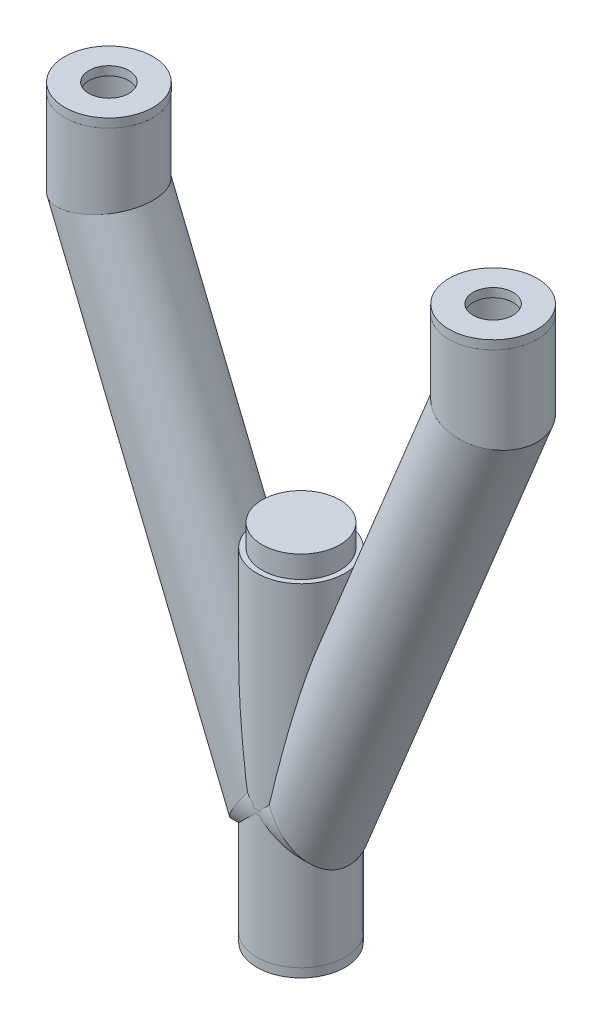
ISO-10303-21;
HEADER;
FILE_DESCRIPTION(('STEP AP214'),'2;1');
FILE_NAME('part.step','',(''),(''),'','','');
FILE_SCHEMA(('AUTOMOTIVE_DESIGN { 1 0 10303 214 1 1 1 1 }'));
ENDSEC;
DATA;
#1=APPLICATION_CONTEXT('core data for automotive mechanical design processes');
#2=APPLICATION_PROTOCOL_DEFINITION('international standard','automotive_design',2000,#1);
#3=PRODUCT_CONTEXT('',#1,'mechanical');
#4=PRODUCT('Part','Part','',(#3));
#5=PRODUCT_RELATED_PRODUCT_CATEGORY('part','',(#4));
#6=PRODUCT_DEFINITION_FORMATION('','',#4);
#7=PRODUCT_DEFINITION_CONTEXT('part definition',#1,'design');
#8=PRODUCT_DEFINITION('design','',#6,#7);
#9=PRODUCT_DEFINITION_SHAPE('','',#8);
#10=(LENGTH_UNIT() NAMED_UNIT(*) SI_UNIT(.MILLI.,.METRE.));
#11=(NAMED_UNIT(*) PLANE_ANGLE_UNIT() SI_UNIT($,.RADIAN.));
#12=(NAMED_UNIT(*) SI_UNIT($,.STERADIAN.) SOLID_ANGLE_UNIT());
#13=UNCERTAINTY_MEASURE_WITH_UNIT(LENGTH_MEASURE(1.E-05),#10,'distance_accuracy_value','');
#14=(GEOMETRIC_REPRESENTATION_CONTEXT(3) GLOBAL_UNCERTAINTY_ASSIGNED_CONTEXT((#13)) GLOBAL_UNIT_ASSIGNED_CONTEXT((#10,
#11,#12)) REPRESENTATION_CONTEXT('',''));
#15=CARTESIAN_POINT('',(0.,0.,0.));
#16=DIRECTION('',(0.,0.,1.));
#17=DIRECTION('',(1.,0.,0.));
#18=AXIS2_PLACEMENT_3D('',#15,#16,#17);
#19=CARTESIAN_POINT('',(0.,-95.6610128055879,0.));
#20=DIRECTION('',(0.,-1.,0.));
#21=DIRECTION('',(0.,0.,-1.));
#22=AXIS2_PLACEMENT_3D('',#19,#20,#21);
#23=PLANE('',#22);
#24=CARTESIAN_POINT('',(0.,-95.6610128055879,0.));
#25=DIRECTION('',(0.,-1.,0.));
#26=DIRECTION('',(0.,0.,-1.));
#27=AXIS2_PLACEMENT_3D('',#24,#25,#26);
#28=CIRCLE('',#27,12.7);
#29=CARTESIAN_POINT('',(0.,-95.6610128055879,-12.7));
#30=VERTEX_POINT('',#29);
#31=EDGE_CURVE('E12',#30,#30,#28,.T.);
#32=ORIENTED_EDGE('',*,*,#31,.T.);
#33=EDGE_LOOP('',(#32));
#34=FACE_BOUND('',#33,.T.);
#35=CARTESIAN_POINT('',(0.,-95.6610128055879,0.));
#36=DIRECTION('',(0.,-1.,0.));
#37=DIRECTION('',(0.,0.,-1.));
#38=AXIS2_PLACEMENT_3D('',#35,#36,#37);
#39=CIRCLE('',#38,5.75);
#40=CARTESIAN_POINT('',(0.,-95.6610128055879,-5.75));
#41=VERTEX_POINT('',#40);
#42=EDGE_CURVE('E69',#41,#41,#39,.T.);
#43=ORIENTED_EDGE('',*,*,#42,.F.);
#44=EDGE_LOOP('',(#43));
#45=FACE_BOUND('',#44,.T.);
#46=ADVANCED_FACE('F58',(#34,#45),#23,.T.);
#47=CARTESIAN_POINT('',(0.,-93.1210128055879,0.));
#48=DIRECTION('',(0.,-1.,0.));
#49=DIRECTION('',(0.,0.,-1.));
#50=AXIS2_PLACEMENT_3D('',#47,#48,#49);
#51=PLANE('',#50);
#52=CARTESIAN_POINT('',(0.,-93.1210128055879,0.));
#53=DIRECTION('',(0.,-1.,0.));
#54=DIRECTION('',(0.,0.,-1.));
#55=AXIS2_PLACEMENT_3D('',#52,#53,#54);
#56=CIRCLE('',#55,12.7);
#57=CARTESIAN_POINT('',(0.,-93.1210128055879,-12.7));
#58=VERTEX_POINT('',#57);
#59=EDGE_CURVE('E62',#58,#58,#56,.T.);
#60=ORIENTED_EDGE('',*,*,#59,.F.);
#61=EDGE_LOOP('',(#60));
#62=FACE_BOUND('',#61,.T.);
#63=CARTESIAN_POINT('',(0.,-93.1210128055879,0.));
#64=DIRECTION('',(0.,-1.,0.));
#65=DIRECTION('',(0.,0.,-1.));
#66=AXIS2_PLACEMENT_3D('',#63,#64,#65);
#67=CIRCLE('',#66,5.75);
#68=CARTESIAN_POINT('',(0.,-93.1210128055879,-5.75));
#69=VERTEX_POINT('',#68);
#70=EDGE_CURVE('E71',#69,#69,#67,.T.);
#71=ORIENTED_EDGE('',*,*,#70,.T.);
#72=EDGE_LOOP('',(#71));
#73=FACE_BOUND('',#72,.T.);
#74=ADVANCED_FACE('F81',(#62,#73),#51,.F.);
#75=CARTESIAN_POINT('',(0.,-95.6610128055879,0.));
#76=DIRECTION('',(0.,1.,0.));
#77=DIRECTION('',(0.,0.,1.));
#78=AXIS2_PLACEMENT_3D('',#75,#76,#77);
#79=CYLINDRICAL_SURFACE('',#78,12.7);
#80=ORIENTED_EDGE('',*,*,#31,.F.);
#81=EDGE_LOOP('',(#80));
#82=FACE_BOUND('',#81,.T.);
#83=ORIENTED_EDGE('',*,*,#59,.T.);
#84=EDGE_LOOP('',(#83));
#85=FACE_BOUND('',#84,.T.);
#86=ADVANCED_FACE('F60',(#82,#85),#79,.T.);
#87=CARTESIAN_POINT('',(0.,-95.6610128055879,0.));
#88=DIRECTION('',(0.,1.,0.));
#89=DIRECTION('',(0.,0.,1.));
#90=AXIS2_PLACEMENT_3D('',#87,#88,#89);
#91=CYLINDRICAL_SURFACE('',#90,5.75);
#92=ORIENTED_EDGE('',*,*,#42,.T.);
#93=EDGE_LOOP('',(#92));
#94=FACE_BOUND('',#93,.T.);
#95=ORIENTED_EDGE('',*,*,#70,.F.);
#96=EDGE_LOOP('',(#95));
#97=FACE_BOUND('',#96,.T.);
#98=ADVANCED_FACE('F77',(#94,#97),#91,.F.);
#99=CLOSED_SHELL('',(#46,#74,#86,#98));
#100=MANIFOLD_SOLID_BREP('B2',#99);
#101=CARTESIAN_POINT('',(0.,8.98905704307334,0.));
#102=DIRECTION('',(0.,-1.,0.));
#103=DIRECTION('',(0.,0.,-1.));
#104=AXIS2_PLACEMENT_3D('',#101,#102,#103);
#105=CYLINDRICAL_SURFACE('',#104,11.2);
#106=CARTESIAN_POINT('',(0.,8.98905704307334,0.));
#107=DIRECTION('',(0.,1.,0.));
#108=DIRECTION('',(0.,0.,-1.));
#109=AXIS2_PLACEMENT_3D('',#106,#107,#108);
#110=CIRCLE('',#109,11.2);
#111=CARTESIAN_POINT('',(0.,8.98905704307334,-11.2));
#112=VERTEX_POINT('',#111);
#113=EDGE_CURVE('E57',#112,#112,#110,.T.);
#114=ORIENTED_EDGE('',*,*,#113,.F.);
#115=EDGE_LOOP('',(#114));
#116=FACE_BOUND('',#115,.T.);
#117=CARTESIAN_POINT('',(0.,2.63905704307334,0.));
#118=DIRECTION('',(0.,1.,0.));
#119=DIRECTION('',(0.,0.,-1.));
#120=AXIS2_PLACEMENT_3D('',#117,#118,#119);
#121=CIRCLE('',#120,11.2);
#122=CARTESIAN_POINT('',(0.,2.63905704307334,-11.2));
#123=VERTEX_POINT('',#122);
#124=EDGE_CURVE('E131',#123,#123,#121,.T.);
#125=ORIENTED_EDGE('',*,*,#124,.T.);
#126=EDGE_LOOP('',(#125));
#127=FACE_BOUND('',#126,.T.);
#128=ADVANCED_FACE('F128',(#116,#127),#105,.T.);
#129=CARTESIAN_POINT('',(0.,8.98905704307334,0.));
#130=DIRECTION('',(0.,1.,0.));
#131=DIRECTION('',(0.,0.,1.));
#132=AXIS2_PLACEMENT_3D('',#129,#130,#131);
#133=PLANE('',#132);
#134=ORIENTED_EDGE('',*,*,#113,.T.);
#135=EDGE_LOOP('',(#134));
#136=FACE_BOUND('',#135,.T.);
#137=ADVANCED_FACE('F143',(#136),#133,.T.);
#138=CARTESIAN_POINT('',(0.,2.63905704307334,0.));
#139=DIRECTION('',(0.,1.,0.));
#140=DIRECTION('',(0.,0.,1.));
#141=AXIS2_PLACEMENT_3D('',#138,#139,#140);
#142=PLANE('',#141);
#143=ORIENTED_EDGE('',*,*,#124,.F.);
#144=EDGE_LOOP('',(#143));
#145=FACE_BOUND('',#144,.T.);
#146=ADVANCED_FACE('F141',(#145),#142,.F.);
#147=CLOSED_SHELL('',(#128,#137,#146));
#148=MANIFOLD_SOLID_BREP('B7',#147);
#149=CARTESIAN_POINT('',(55.3142806569062,91.1369150174622,0.));
#150=DIRECTION('',(0.,-1.,0.));
#151=DIRECTION('',(1.,0.,0.));
#152=AXIS2_PLACEMENT_3D('',#149,#150,#151);
#153=PLANE('',#152);
#154=CARTESIAN_POINT('',(55.3142806569062,91.1369150174622,0.));
#155=DIRECTION('',(0.,1.,0.));
#156=DIRECTION('',(1.,0.,0.));
#157=AXIS2_PLACEMENT_3D('',#154,#155,#156);
#158=CIRCLE('',#157,12.7);
#159=CARTESIAN_POINT('',(68.0142806569062,91.1369150174622,0.));
#160=VERTEX_POINT('',#159);
#161=EDGE_CURVE('E127',#160,#160,#158,.T.);
#162=ORIENTED_EDGE('',*,*,#161,.T.);
#163=EDGE_LOOP('',(#162));
#164=FACE_BOUND('',#163,.T.);
#165=CARTESIAN_POINT('',(55.3142806569062,91.1369150174622,0.));
#166=DIRECTION('',(0.,1.,0.));
#167=DIRECTION('',(1.,0.,0.));
#168=AXIS2_PLACEMENT_3D('',#165,#166,#167);
#169=CIRCLE('',#168,5.75);
#170=CARTESIAN_POINT('',(61.0642806569062,91.1369150174622,0.));
#171=VERTEX_POINT('',#170);
#172=EDGE_CURVE('E188',#171,#171,#169,.T.);
#173=ORIENTED_EDGE('',*,*,#172,.F.);
#174=EDGE_LOOP('',(#173));
#175=FACE_BOUND('',#174,.T.);
#176=ADVANCED_FACE('F177',(#164,#175),#153,.F.);
#177=CARTESIAN_POINT('',(55.3142806569062,88.5969150174622,0.));
#178=DIRECTION('',(0.,-1.,0.));
#179=DIRECTION('',(1.,0.,0.));
#180=AXIS2_PLACEMENT_3D('',#177,#178,#179);
#181=PLANE('',#180);
#182=CARTESIAN_POINT('',(55.3142806569062,88.5969150174622,0.));
#183=DIRECTION('',(0.,1.,0.));
#184=DIRECTION('',(1.,0.,0.));
#185=AXIS2_PLACEMENT_3D('',#182,#183,#184);
#186=CIRCLE('',#185,12.7);
#187=CARTESIAN_POINT('',(68.0142806569062,88.5969150174622,0.));
#188=VERTEX_POINT('',#187);
#189=EDGE_CURVE('E181',#188,#188,#186,.T.);
#190=ORIENTED_EDGE('',*,*,#189,.F.);
#191=EDGE_LOOP('',(#190));
#192=FACE_BOUND('',#191,.T.);
#193=CARTESIAN_POINT('',(55.3142806569062,88.5969150174622,0.));
#194=DIRECTION('',(0.,1.,0.));
#195=DIRECTION('',(1.,0.,0.));
#196=AXIS2_PLACEMENT_3D('',#193,#194,#195);
#197=CIRCLE('',#196,5.75);
#198=CARTESIAN_POINT('',(61.0642806569062,88.5969150174622,0.));
#199=VERTEX_POINT('',#198);
#200=EDGE_CURVE('E190',#199,#199,#197,.T.);
#201=ORIENTED_EDGE('',*,*,#200,.T.);
#202=EDGE_LOOP('',(#201));
#203=FACE_BOUND('',#202,.T.);
#204=ADVANCED_FACE('F200',(#192,#203),#181,.T.);
#205=CARTESIAN_POINT('',(55.3142806569062,91.1369150174622,0.));
#206=DIRECTION('',(0.,-1.,0.));
#207=DIRECTION('',(1.,0.,0.));
#208=AXIS2_PLACEMENT_3D('',#205,#206,#207);
#209=CYLINDRICAL_SURFACE('',#208,12.7);
#210=ORIENTED_EDGE('',*,*,#161,.F.);
#211=EDGE_LOOP('',(#210));
#212=FACE_BOUND('',#211,.T.);
#213=ORIENTED_EDGE('',*,*,#189,.T.);
#214=EDGE_LOOP('',(#213));
#215=FACE_BOUND('',#214,.T.);
#216=ADVANCED_FACE('F179',(#212,#215),#209,.T.);
#217=CARTESIAN_POINT('',(55.3142806569062,91.1369150174622,0.));
#218=DIRECTION('',(0.,-1.,0.));
#219=DIRECTION('',(1.,0.,0.));
#220=AXIS2_PLACEMENT_3D('',#217,#218,#219);
#221=CYLINDRICAL_SURFACE('',#220,5.75);
#222=ORIENTED_EDGE('',*,*,#172,.T.);
#223=EDGE_LOOP('',(#222));
#224=FACE_BOUND('',#223,.T.);
#225=ORIENTED_EDGE('',*,*,#200,.F.);
#226=EDGE_LOOP('',(#225));
#227=FACE_BOUND('',#226,.T.);
#228=ADVANCED_FACE('F196',(#224,#227),#221,.F.);
#229=CLOSED_SHELL('',(#176,#204,#216,#228));
#230=MANIFOLD_SOLID_BREP('B52',#229);
#231=CARTESIAN_POINT('',(-55.3142806569062,91.1369150174622,0.));
#232=DIRECTION('',(0.,1.,0.));
#233=DIRECTION('',(-1.,0.,0.));
#234=AXIS2_PLACEMENT_3D('',#231,#232,#233);
#235=PLANE('',#234);
#236=CARTESIAN_POINT('',(-55.3142806569062,91.1369150174622,0.));
#237=DIRECTION('',(0.,1.,0.));
#238=DIRECTION('',(-1.,0.,0.));
#239=AXIS2_PLACEMENT_3D('',#236,#237,#238);
#240=CIRCLE('',#239,12.7);
#241=CARTESIAN_POINT('',(-68.0142806569063,91.1369150174622,0.));
#242=VERTEX_POINT('',#241);
#243=EDGE_CURVE('E176',#242,#242,#240,.T.);
#244=ORIENTED_EDGE('',*,*,#243,.T.);
#245=EDGE_LOOP('',(#244));
#246=FACE_BOUND('',#245,.T.);
#247=CARTESIAN_POINT('',(-55.3142806569062,91.1369150174622,0.));
#248=DIRECTION('',(0.,1.,0.));
#249=DIRECTION('',(-1.,0.,0.));
#250=AXIS2_PLACEMENT_3D('',#247,#248,#249);
#251=CIRCLE('',#250,5.75);
#252=CARTESIAN_POINT('',(-61.0642806569062,91.1369150174622,0.));
#253=VERTEX_POINT('',#252);
#254=EDGE_CURVE('E250',#253,#253,#251,.T.);
#255=ORIENTED_EDGE('',*,*,#254,.F.);
#256=EDGE_LOOP('',(#255));
#257=FACE_BOUND('',#256,.T.);
#258=ADVANCED_FACE('F239',(#246,#257),#235,.T.);
#259=CARTESIAN_POINT('',(-55.3142806569062,88.5969150174622,0.));
#260=DIRECTION('',(0.,1.,0.));
#261=DIRECTION('',(-1.,0.,0.));
#262=AXIS2_PLACEMENT_3D('',#259,#260,#261);
#263=PLANE('',#262);
#264=CARTESIAN_POINT('',(-55.3142806569062,88.5969150174622,0.));
#265=DIRECTION('',(0.,1.,0.));
#266=DIRECTION('',(-1.,0.,0.));
#267=AXIS2_PLACEMENT_3D('',#264,#265,#266);
#268=CIRCLE('',#267,12.7);
#269=CARTESIAN_POINT('',(-68.0142806569063,88.5969150174622,0.));
#270=VERTEX_POINT('',#269);
#271=EDGE_CURVE('E243',#270,#270,#268,.T.);
#272=ORIENTED_EDGE('',*,*,#271,.F.);
#273=EDGE_LOOP('',(#272));
#274=FACE_BOUND('',#273,.T.);
#275=CARTESIAN_POINT('',(-55.3142806569062,88.5969150174622,0.));
#276=DIRECTION('',(0.,1.,0.));
#277=DIRECTION('',(-1.,0.,0.));
#278=AXIS2_PLACEMENT_3D('',#275,#276,#277);
#279=CIRCLE('',#278,5.75);
#280=CARTESIAN_POINT('',(-61.0642806569062,88.5969150174622,0.));
#281=VERTEX_POINT('',#280);
#282=EDGE_CURVE('E252',#281,#281,#279,.T.);
#283=ORIENTED_EDGE('',*,*,#282,.T.);
#284=EDGE_LOOP('',(#283));
#285=FACE_BOUND('',#284,.T.);
#286=ADVANCED_FACE('F262',(#274,#285),#263,.F.);
#287=CARTESIAN_POINT('',(-55.3142806569062,91.1369150174622,0.));
#288=DIRECTION('',(0.,-1.,0.));
#289=DIRECTION('',(1.,0.,0.));
#290=AXIS2_PLACEMENT_3D('',#287,#288,#289);
#291=CYLINDRICAL_SURFACE('',#290,12.7);
#292=ORIENTED_EDGE('',*,*,#243,.F.);
#293=EDGE_LOOP('',(#292));
#294=FACE_BOUND('',#293,.T.);
#295=ORIENTED_EDGE('',*,*,#271,.T.);
#296=EDGE_LOOP('',(#295));
#297=FACE_BOUND('',#296,.T.);
#298=ADVANCED_FACE('F241',(#294,#297),#291,.T.);
#299=CARTESIAN_POINT('',(-55.3142806569062,91.1369150174622,0.));
#300=DIRECTION('',(0.,-1.,0.));
#301=DIRECTION('',(1.,0.,0.));
#302=AXIS2_PLACEMENT_3D('',#299,#300,#301);
#303=CYLINDRICAL_SURFACE('',#302,5.75);
#304=ORIENTED_EDGE('',*,*,#254,.T.);
#305=EDGE_LOOP('',(#304));
#306=FACE_BOUND('',#305,.T.);
#307=ORIENTED_EDGE('',*,*,#282,.F.);
#308=EDGE_LOOP('',(#307));
#309=FACE_BOUND('',#308,.T.);
#310=ADVANCED_FACE('F258',(#306,#309),#303,.F.);
#311=CLOSED_SHELL('',(#258,#286,#298,#310));
#312=MANIFOLD_SOLID_BREP('B122',#311);
#313=CARTESIAN_POINT('',(0.,-93.1210128055879,0.));
#314=DIRECTION('',(0.,1.,0.));
#315=DIRECTION('',(0.,0.,1.));
#316=AXIS2_PLACEMENT_3D('',#313,#314,#315);
#317=CYLINDRICAL_SURFACE('',#316,9.7);
#318=CARTESIAN_POINT('',(0.,-93.1210128055879,0.));
#319=DIRECTION('',(0.,-1.,0.));
#320=DIRECTION('',(0.,0.,-1.));
#321=AXIS2_PLACEMENT_3D('',#318,#319,#320);
#322=CIRCLE('',#321,9.7);
#323=CARTESIAN_POINT('',(0.,-93.1210128055879,-9.7));
#324=VERTEX_POINT('',#323);
#325=EDGE_CURVE('E308',#324,#324,#322,.T.);
#326=ORIENTED_EDGE('',*,*,#325,.T.);
#327=EDGE_LOOP('',(#326));
#328=FACE_BOUND('',#327,.T.);
#329=CARTESIAN_POINT('',(0.,2.63905704307334,0.));
#330=DIRECTION('',(0.,-1.,0.));
#331=DIRECTION('',(0.,0.,-1.));
#332=AXIS2_PLACEMENT_3D('',#329,#330,#331);
#333=CIRCLE('',#332,9.7);
#334=CARTESIAN_POINT('',(0.,2.63905704307334,-9.7));
#335=VERTEX_POINT('',#334);
#336=EDGE_CURVE('E314',#335,#335,#333,.T.);
#337=ORIENTED_EDGE('',*,*,#336,.F.);
#338=EDGE_LOOP('',(#337));
#339=FACE_BOUND('',#338,.T.);
#340=ADVANCED_FACE('F301',(#328,#339),#317,.F.);
#341=CARTESIAN_POINT('',(0.,-93.1210128055879,0.));
#342=DIRECTION('',(0.,1.,0.));
#343=DIRECTION('',(0.,0.,1.));
#344=AXIS2_PLACEMENT_3D('',#341,#342,#343);
#345=CYLINDRICAL_SURFACE('',#344,12.7);
#346=CARTESIAN_POINT('',(0.,-93.1210128055879,0.));
#347=DIRECTION('',(0.,-1.,0.));
#348=DIRECTION('',(0.,0.,-1.));
#349=AXIS2_PLACEMENT_3D('',#346,#347,#348);
#350=CIRCLE('',#349,12.7);
#351=CARTESIAN_POINT('',(0.,-93.1210128055879,-12.7));
#352=VERTEX_POINT('',#351);
#353=EDGE_CURVE('E238',#352,#352,#350,.T.);
#354=ORIENTED_EDGE('',*,*,#353,.F.);
#355=EDGE_LOOP('',(#354));
#356=FACE_BOUND('',#355,.T.);
#357=CARTESIAN_POINT('',(0.,2.63905704307334,0.));
#358=DIRECTION('',(0.,-1.,0.));
#359=DIRECTION('',(0.,0.,-1.));
#360=AXIS2_PLACEMENT_3D('',#357,#358,#359);
#361=CIRCLE('',#360,12.7);
#362=CARTESIAN_POINT('',(0.,2.63905704307334,-12.7));
#363=VERTEX_POINT('',#362);
#364=EDGE_CURVE('E304',#363,#363,#361,.T.);
#365=ORIENTED_EDGE('',*,*,#364,.T.);
#366=EDGE_LOOP('',(#365));
#367=FACE_BOUND('',#366,.T.);
#368=ADVANCED_FACE('F321',(#356,#367),#345,.T.);
#369=CARTESIAN_POINT('',(0.,-93.1210128055879,0.));
#370=DIRECTION('',(0.,-1.,0.));
#371=DIRECTION('',(0.,0.,-1.));
#372=AXIS2_PLACEMENT_3D('',#369,#370,#371);
#373=PLANE('',#372);
#374=ORIENTED_EDGE('',*,*,#325,.F.);
#375=EDGE_LOOP('',(#374));
#376=FACE_BOUND('',#375,.T.);
#377=ORIENTED_EDGE('',*,*,#353,.T.);
#378=EDGE_LOOP('',(#377));
#379=FACE_BOUND('',#378,.T.);
#380=ADVANCED_FACE('F325',(#376,#379),#373,.T.);
#381=CARTESIAN_POINT('',(0.,2.63905704307334,0.));
#382=DIRECTION('',(0.,-1.,0.));
#383=DIRECTION('',(0.,0.,-1.));
#384=AXIS2_PLACEMENT_3D('',#381,#382,#383);
#385=PLANE('',#384);
#386=ORIENTED_EDGE('',*,*,#336,.T.);
#387=EDGE_LOOP('',(#386));
#388=FACE_BOUND('',#387,.T.);
#389=ORIENTED_EDGE('',*,*,#364,.F.);
#390=EDGE_LOOP('',(#389));
#391=FACE_BOUND('',#390,.T.);
#392=ADVANCED_FACE('F323',(#388,#391),#385,.F.);
#393=CLOSED_SHELL('',(#340,#368,#380,#392));
#394=MANIFOLD_SOLID_BREP('B171',#393);
#395=CARTESIAN_POINT('',(-55.3142806569062,65.4737485448196,0.));
#396=DIRECTION('',(0.,1.,0.));
#397=DIRECTION('',(0.,0.,1.));
#398=AXIS2_PLACEMENT_3D('',#395,#396,#397);
#399=CYLINDRICAL_SURFACE('',#398,9.7);
#400=CARTESIAN_POINT('',(-55.3142806569062,88.5969150174622,0.));
#401=DIRECTION('',(0.,-1.,0.));
#402=DIRECTION('',(0.,0.,-1.));
#403=AXIS2_PLACEMENT_3D('',#400,#401,#402);
#404=CIRCLE('',#403,9.7);
#405=CARTESIAN_POINT('',(-55.3142806569062,88.5969150174622,-9.7));
#406=VERTEX_POINT('',#405);
#407=EDGE_CURVE('E389',#406,#406,#404,.T.);
#408=ORIENTED_EDGE('',*,*,#407,.F.);
#409=EDGE_LOOP('',(#408));
#410=FACE_BOUND('',#409,.T.);
#411=CARTESIAN_POINT('',(-55.3142806569062,65.4737485448196,0.));
#412=DIRECTION('',(0.192745590364238,-0.981248764277001,0.));
#413=DIRECTION('',(0.981248764277001,0.192745590364238,0.));
#414=AXIS2_PLACEMENT_3D('',#411,#412,#413);
#415=ELLIPSE('',#414,9.88536276746,9.7);
#416=CARTESIAN_POINT('',(-45.6142806569062,67.3791086273983,0.));
#417=VERTEX_POINT('',#416);
#418=EDGE_CURVE('E385',#417,#417,#415,.T.);
#419=ORIENTED_EDGE('',*,*,#418,.T.);
#420=EDGE_LOOP('',(#419));
#421=FACE_BOUND('',#420,.T.);
#422=ADVANCED_FACE('F381',(#410,#421),#399,.F.);
#423=CARTESIAN_POINT('',(-55.3142806569062,65.4737485448196,0.));
#424=DIRECTION('',(0.,1.,0.));
#425=DIRECTION('',(0.,0.,1.));
#426=AXIS2_PLACEMENT_3D('',#423,#424,#425);
#427=CYLINDRICAL_SURFACE('',#426,12.7);
#428=CARTESIAN_POINT('',(-55.3142806569062,88.5969150174622,0.));
#429=DIRECTION('',(0.,-1.,0.));
#430=DIRECTION('',(0.,0.,-1.));
#431=AXIS2_PLACEMENT_3D('',#428,#429,#430);
#432=CIRCLE('',#431,12.7);
#433=CARTESIAN_POINT('',(-55.3142806569062,88.5969150174622,-12.7));
#434=VERTEX_POINT('',#433);
#435=EDGE_CURVE('E393',#434,#434,#432,.T.);
#436=ORIENTED_EDGE('',*,*,#435,.T.);
#437=EDGE_LOOP('',(#436));
#438=FACE_BOUND('',#437,.T.);
#439=CARTESIAN_POINT('',(-55.3142806569062,65.4737485448196,0.));
#440=DIRECTION('',(0.192745590364238,-0.981248764277001,0.));
#441=DIRECTION('',(0.981248764277001,0.192745590364238,0.));
#442=AXIS2_PLACEMENT_3D('',#439,#440,#441);
#443=ELLIPSE('',#442,12.942691458427,12.7);
#444=CARTESIAN_POINT('',(-42.6142806569062,67.9683952508763,0.));
#445=VERTEX_POINT('',#444);
#446=EDGE_CURVE('E300',#445,#445,#443,.T.);
#447=ORIENTED_EDGE('',*,*,#446,.F.);
#448=EDGE_LOOP('',(#447));
#449=FACE_BOUND('',#448,.T.);
#450=ADVANCED_FACE('F408',(#438,#449),#427,.T.);
#451=CARTESIAN_POINT('',(-55.3142806569062,88.5969150174622,0.));
#452=DIRECTION('',(0.,-1.,0.));
#453=DIRECTION('',(0.,0.,-1.));
#454=AXIS2_PLACEMENT_3D('',#451,#452,#453);
#455=PLANE('',#454);
#456=ORIENTED_EDGE('',*,*,#407,.T.);
#457=EDGE_LOOP('',(#456));
#458=FACE_BOUND('',#457,.T.);
#459=ORIENTED_EDGE('',*,*,#435,.F.);
#460=EDGE_LOOP('',(#459));
#461=FACE_BOUND('',#460,.T.);
#462=ADVANCED_FACE('F404',(#458,#461),#455,.F.);
#463=CARTESIAN_POINT('',(-55.3142806569062,65.4737485448196,0.));
#464=DIRECTION('',(0.192745590364238,-0.981248764277001,0.));
#465=DIRECTION('',(0.981248764277001,0.192745590364238,0.));
#466=AXIS2_PLACEMENT_3D('',#463,#464,#465);
#467=PLANE('',#466);
#468=ORIENTED_EDGE('',*,*,#418,.F.);
#469=EDGE_LOOP('',(#468));
#470=FACE_BOUND('',#469,.T.);
#471=ORIENTED_EDGE('',*,*,#446,.T.);
#472=EDGE_LOOP('',(#471));
#473=FACE_BOUND('',#472,.T.);
#474=ADVANCED_FACE('F383',(#470,#473),#467,.T.);
#475=CLOSED_SHELL('',(#422,#450,#462,#474));
#476=MANIFOLD_SOLID_BREP('B233',#475);
#477=CARTESIAN_POINT('',(-5.29786622151622,-56.9282305005821,0.));
#478=DIRECTION('',(-0.3782627447295,0.925698274790283,0.));
#479=DIRECTION('',(-0.925698274790283,-0.3782627447295,0.));
#480=AXIS2_PLACEMENT_3D('',#477,#478,#479);
#481=CYLINDRICAL_SURFACE('',#480,9.7);
#482=CARTESIAN_POINT('',(-5.29786622151622,-56.9282305005821,0.));
#483=DIRECTION('',(0.830139369241545,-0.55755594126083,0.));
#484=DIRECTION('',(0.55755594126083,0.830139369241545,0.));
#485=AXIS2_PLACEMENT_3D('',#482,#483,#484);
#486=ELLIPSE('',#485,11.6847849402232,9.7);
#487=CARTESIAN_POINT('',(1.21705504426031,-47.2282305005821,0.));
#488=VERTEX_POINT('',#487);
#489=EDGE_CURVE('E484',#488,#488,#486,.T.);
#490=ORIENTED_EDGE('',*,*,#489,.T.);
#491=EDGE_LOOP('',(#490));
#492=FACE_BOUND('',#491,.T.);
#493=CARTESIAN_POINT('',(-55.3142806569063,65.4737485448196,0.));
#494=DIRECTION('',(-0.192745590364238,0.981248764277001,0.));
#495=DIRECTION('',(-0.981248764277001,-0.192745590364238,0.));
#496=AXIS2_PLACEMENT_3D('',#493,#494,#495);
#497=ELLIPSE('',#496,9.88536276746,9.7);
#498=CARTESIAN_POINT('',(-65.0142806569063,63.5683884622409,0.));
#499=VERTEX_POINT('',#498);
#500=EDGE_CURVE('E474',#499,#499,#497,.T.);
#501=ORIENTED_EDGE('',*,*,#500,.T.);
#502=EDGE_LOOP('',(#501));
#503=FACE_BOUND('',#502,.T.);
#504=ADVANCED_FACE('F470',(#492,#503),#481,.F.);
#505=CARTESIAN_POINT('',(-5.29786622151622,-56.9282305005821,0.));
#506=DIRECTION('',(-0.3782627447295,0.925698274790283,0.));
#507=DIRECTION('',(-0.925698274790283,-0.3782627447295,0.));
#508=AXIS2_PLACEMENT_3D('',#505,#506,#507);
#509=CYLINDRICAL_SURFACE('',#508,12.7);
#510=CARTESIAN_POINT('',(-5.29786622151622,-56.9282305005821,0.));
#511=DIRECTION('',(0.830139369241545,-0.55755594126083,0.));
#512=DIRECTION('',(0.55755594126083,0.830139369241545,0.));
#513=AXIS2_PLACEMENT_3D('',#510,#511,#512);
#514=ELLIPSE('',#513,15.2986359526634,12.7);
#515=CARTESIAN_POINT('',(3.23197914707779,-44.2282305005821,0.));
#516=VERTEX_POINT('',#515);
#517=EDGE_CURVE('E478',#516,#516,#514,.T.);
#518=ORIENTED_EDGE('',*,*,#517,.F.);
#519=EDGE_LOOP('',(#518));
#520=FACE_BOUND('',#519,.T.);
#521=CARTESIAN_POINT('',(-55.3142806569063,65.4737485448196,0.));
#522=DIRECTION('',(-0.192745590364238,0.981248764277001,0.));
#523=DIRECTION('',(-0.981248764277001,-0.192745590364238,0.));
#524=AXIS2_PLACEMENT_3D('',#521,#522,#523);
#525=ELLIPSE('',#524,12.942691458427,12.7);
#526=CARTESIAN_POINT('',(-68.0142806569063,62.9791018387629,0.));
#527=VERTEX_POINT('',#526);
#528=EDGE_CURVE('E380',#527,#527,#525,.T.);
#529=ORIENTED_EDGE('',*,*,#528,.F.);
#530=EDGE_LOOP('',(#529));
#531=FACE_BOUND('',#530,.T.);
#532=ADVANCED_FACE('F497',(#520,#531),#509,.T.);
#533=CARTESIAN_POINT('',(-5.29786622151622,-56.9282305005821,0.));
#534=DIRECTION('',(0.830139369241545,-0.55755594126083,0.));
#535=DIRECTION('',(0.55755594126083,0.830139369241545,0.));
#536=AXIS2_PLACEMENT_3D('',#533,#534,#535);
#537=PLANE('',#536);
#538=ORIENTED_EDGE('',*,*,#489,.F.);
#539=EDGE_LOOP('',(#538));
#540=FACE_BOUND('',#539,.T.);
#541=ORIENTED_EDGE('',*,*,#517,.T.);
#542=EDGE_LOOP('',(#541));
#543=FACE_BOUND('',#542,.T.);
#544=ADVANCED_FACE('F493',(#540,#543),#537,.T.);
#545=CARTESIAN_POINT('',(-55.3142806569063,65.4737485448196,0.));
#546=DIRECTION('',(-0.192745590364238,0.981248764277001,0.));
#547=DIRECTION('',(-0.981248764277001,-0.192745590364238,0.));
#548=AXIS2_PLACEMENT_3D('',#545,#546,#547);
#549=PLANE('',#548);
#550=ORIENTED_EDGE('',*,*,#500,.F.);
#551=EDGE_LOOP('',(#550));
#552=FACE_BOUND('',#551,.T.);
#553=ORIENTED_EDGE('',*,*,#528,.T.);
#554=EDGE_LOOP('',(#553));
#555=FACE_BOUND('',#554,.T.);
#556=ADVANCED_FACE('F472',(#552,#555),#549,.T.);
#557=CLOSED_SHELL('',(#504,#532,#544,#556));
#558=MANIFOLD_SOLID_BREP('B295',#557);
#559=CARTESIAN_POINT('',(-5.29786622151623,-56.9282305005821,0.));
#560=DIRECTION('',(-0.830139369241545,0.55755594126083,0.));
#561=DIRECTION('',(-0.55755594126083,-0.830139369241545,0.));
#562=AXIS2_PLACEMENT_3D('',#559,#560,#561);
#563=PLANE('',#562);
#564=DIRECTION('',(0.,0.,1.));
#565=VECTOR('',#564,1.);
#566=CARTESIAN_POINT('',(0.,-49.0402913755676,0.));
#567=LINE('',#566,#565);
#568=CARTESIAN_POINT('',(0.,-49.0402913755676,-9.95341229730117));
#569=VERTEX_POINT('',#568);
#570=CARTESIAN_POINT('',(0.,-49.0402913755676,-5.64538894674814));
#571=VERTEX_POINT('',#570);
#572=EDGE_CURVE('E580',#569,#571,#567,.T.);
#573=ORIENTED_EDGE('',*,*,#572,.F.);
#574=CARTESIAN_POINT('',(-5.29786622151622,-56.9282305005821,0.));
#575=DIRECTION('',(-0.830139369241545,0.55755594126083,0.));
#576=DIRECTION('',(-0.55755594126083,-0.830139369241545,0.));
#577=AXIS2_PLACEMENT_3D('',#574,#575,#576);
#578=ELLIPSE('',#577,15.2986359526634,12.7);
#579=CARTESIAN_POINT('',(0.,-49.0402913755676,9.95341229730117));
#580=VERTEX_POINT('',#579);
#581=EDGE_CURVE('E583',#569,#580,#578,.T.);
#582=ORIENTED_EDGE('',*,*,#581,.T.);
#583=CARTESIAN_POINT('',(0.,-49.0402913755676,5.64538894674814));
#584=VERTEX_POINT('',#583);
#585=EDGE_CURVE('E586',#584,#580,#567,.T.);
#586=ORIENTED_EDGE('',*,*,#585,.F.);
#587=CARTESIAN_POINT('',(-5.29786622151622,-56.9282305005821,0.));
#588=DIRECTION('',(-0.830139369241545,0.55755594126083,0.));
#589=DIRECTION('',(-0.55755594126083,-0.830139369241545,0.));
#590=AXIS2_PLACEMENT_3D('',#587,#588,#589);
#591=ELLIPSE('',#590,11.6847849402232,9.7);
#592=EDGE_CURVE('E468',#571,#584,#591,.T.);
#593=ORIENTED_EDGE('',*,*,#592,.F.);
#594=EDGE_LOOP('',(#573,#582,#586,#593));
#595=FACE_BOUND('',#594,.T.);
#596=ADVANCED_FACE('F559',(#595),#563,.T.);
#597=CARTESIAN_POINT('',(5.29786622151623,-56.9282305005821,0.));
#598=DIRECTION('',(0.830139369241545,0.55755594126083,0.));
#599=DIRECTION('',(-0.55755594126083,0.830139369241545,0.));
#600=AXIS2_PLACEMENT_3D('',#597,#598,#599);
#601=PLANE('',#600);
#602=CARTESIAN_POINT('',(5.29786622151623,-56.9282305005821,0.));
#603=DIRECTION('',(0.830139369241545,0.55755594126083,0.));
#604=DIRECTION('',(-0.55755594126083,0.830139369241545,0.));
#605=AXIS2_PLACEMENT_3D('',#602,#603,#604);
#606=ELLIPSE('',#605,15.2986359526634,12.7);
#607=EDGE_CURVE('E588',#580,#569,#606,.T.);
#608=ORIENTED_EDGE('',*,*,#607,.T.);
#609=ORIENTED_EDGE('',*,*,#572,.T.);
#610=CARTESIAN_POINT('',(5.29786622151623,-56.9282305005821,0.));
#611=DIRECTION('',(0.830139369241545,0.55755594126083,0.));
#612=DIRECTION('',(-0.55755594126083,0.830139369241545,0.));
#613=AXIS2_PLACEMENT_3D('',#610,#611,#612);
#614=ELLIPSE('',#613,11.6847849402232,9.7);
#615=EDGE_CURVE('E562',#584,#571,#614,.T.);
#616=ORIENTED_EDGE('',*,*,#615,.F.);
#617=ORIENTED_EDGE('',*,*,#585,.T.);
#618=EDGE_LOOP('',(#608,#609,#616,#617));
#619=FACE_BOUND('',#618,.T.);
#620=ADVANCED_FACE('F593',(#619),#601,.T.);
#621=CARTESIAN_POINT('',(5.29786622151625,-56.9282305005821,0.));
#622=DIRECTION('',(-1.,0.,0.));
#623=DIRECTION('',(0.,0.,1.));
#624=AXIS2_PLACEMENT_3D('',#621,#622,#623);
#625=CYLINDRICAL_SURFACE('',#624,12.7);
#626=ORIENTED_EDGE('',*,*,#581,.F.);
#627=ORIENTED_EDGE('',*,*,#607,.F.);
#628=EDGE_LOOP('',(#626,#627));
#629=FACE_BOUND('',#628,.T.);
#630=ADVANCED_FACE('F590',(#629),#625,.T.);
#631=CARTESIAN_POINT('',(5.29786622151625,-56.9282305005821,0.));
#632=DIRECTION('',(-1.,0.,0.));
#633=DIRECTION('',(0.,0.,1.));
#634=AXIS2_PLACEMENT_3D('',#631,#632,#633);
#635=CYLINDRICAL_SURFACE('',#634,9.7);
#636=ORIENTED_EDGE('',*,*,#615,.T.);
#637=ORIENTED_EDGE('',*,*,#592,.T.);
#638=EDGE_LOOP('',(#636,#637));
#639=FACE_BOUND('',#638,.T.);
#640=ADVANCED_FACE('F596',(#639),#635,.F.);
#641=CLOSED_SHELL('',(#596,#620,#630,#640));
#642=MANIFOLD_SOLID_BREP('B375',#641);
#643=CARTESIAN_POINT('',(55.3142806569062,65.4737485448196,0.));
#644=DIRECTION('',(-0.3782627447295,-0.925698274790283,0.));
#645=DIRECTION('',(0.925698274790283,-0.3782627447295,0.));
#646=AXIS2_PLACEMENT_3D('',#643,#644,#645);
#647=CYLINDRICAL_SURFACE('',#646,9.7);
#648=CARTESIAN_POINT('',(55.3142806569062,65.4737485448195,0.));
#649=DIRECTION('',(0.192745590364238,0.981248764277001,0.));
#650=DIRECTION('',(-0.981248764277001,0.192745590364238,0.));
#651=AXIS2_PLACEMENT_3D('',#648,#649,#650);
#652=ELLIPSE('',#651,9.88536276746,9.7);
#653=CARTESIAN_POINT('',(45.6142806569062,67.3791086273983,0.));
#654=VERTEX_POINT('',#653);
#655=EDGE_CURVE('E680',#654,#654,#652,.T.);
#656=ORIENTED_EDGE('',*,*,#655,.T.);
#657=EDGE_LOOP('',(#656));
#658=FACE_BOUND('',#657,.T.);
#659=CARTESIAN_POINT('',(5.29786622151624,-56.9282305005821,0.));
#660=DIRECTION('',(-0.830139369241545,-0.55755594126083,0.));
#661=DIRECTION('',(0.55755594126083,-0.830139369241545,0.));
#662=AXIS2_PLACEMENT_3D('',#659,#660,#661);
#663=ELLIPSE('',#662,11.6847849402232,9.7);
#664=CARTESIAN_POINT('',(11.8127874872928,-66.628230500582,0.));
#665=VERTEX_POINT('',#664);
#666=EDGE_CURVE('E668',#665,#665,#663,.T.);
#667=ORIENTED_EDGE('',*,*,#666,.T.);
#668=EDGE_LOOP('',(#667));
#669=FACE_BOUND('',#668,.T.);
#670=ADVANCED_FACE('F664',(#658,#669),#647,.F.);
#671=CARTESIAN_POINT('',(55.3142806569062,65.4737485448196,0.));
#672=DIRECTION('',(-0.3782627447295,-0.925698274790283,0.));
#673=DIRECTION('',(0.925698274790283,-0.3782627447295,0.));
#674=AXIS2_PLACEMENT_3D('',#671,#672,#673);
#675=CYLINDRICAL_SURFACE('',#674,12.7);
#676=CARTESIAN_POINT('',(55.3142806569062,65.4737485448195,0.));
#677=DIRECTION('',(0.192745590364238,0.981248764277001,0.));
#678=DIRECTION('',(-0.981248764277001,0.192745590364238,0.));
#679=AXIS2_PLACEMENT_3D('',#676,#677,#678);
#680=ELLIPSE('',#679,12.942691458427,12.7);
#681=CARTESIAN_POINT('',(42.6142806569062,67.9683952508763,0.));
#682=VERTEX_POINT('',#681);
#683=EDGE_CURVE('E673',#682,#682,#680,.T.);
#684=ORIENTED_EDGE('',*,*,#683,.F.);
#685=EDGE_LOOP('',(#684));
#686=FACE_BOUND('',#685,.T.);
#687=CARTESIAN_POINT('',(5.29786622151624,-56.9282305005821,0.));
#688=DIRECTION('',(-0.830139369241545,-0.55755594126083,0.));
#689=DIRECTION('',(0.55755594126083,-0.830139369241545,0.));
#690=AXIS2_PLACEMENT_3D('',#687,#688,#689);
#691=ELLIPSE('',#690,15.2986359526634,12.7);
#692=CARTESIAN_POINT('',(13.8277115901102,-69.628230500582,0.));
#693=VERTEX_POINT('',#692);
#694=EDGE_CURVE('E558',#693,#693,#691,.T.);
#695=ORIENTED_EDGE('',*,*,#694,.F.);
#696=EDGE_LOOP('',(#695));
#697=FACE_BOUND('',#696,.T.);
#698=ADVANCED_FACE('F695',(#686,#697),#675,.T.);
#699=CARTESIAN_POINT('',(55.3142806569062,65.4737485448195,0.));
#700=DIRECTION('',(0.192745590364238,0.981248764277001,0.));
#701=DIRECTION('',(-0.981248764277001,0.192745590364238,0.));
#702=AXIS2_PLACEMENT_3D('',#699,#700,#701);
#703=PLANE('',#702);
#704=ORIENTED_EDGE('',*,*,#655,.F.);
#705=EDGE_LOOP('',(#704));
#706=FACE_BOUND('',#705,.T.);
#707=ORIENTED_EDGE('',*,*,#683,.T.);
#708=EDGE_LOOP('',(#707));
#709=FACE_BOUND('',#708,.T.);
#710=ADVANCED_FACE('F691',(#706,#709),#703,.T.);
#711=CARTESIAN_POINT('',(5.29786622151624,-56.9282305005821,0.));
#712=DIRECTION('',(-0.830139369241545,-0.55755594126083,0.));
#713=DIRECTION('',(0.55755594126083,-0.830139369241545,0.));
#714=AXIS2_PLACEMENT_3D('',#711,#712,#713);
#715=PLANE('',#714);
#716=ORIENTED_EDGE('',*,*,#666,.F.);
#717=EDGE_LOOP('',(#716));
#718=FACE_BOUND('',#717,.T.);
#719=ORIENTED_EDGE('',*,*,#694,.T.);
#720=EDGE_LOOP('',(#719));
#721=FACE_BOUND('',#720,.T.);
#722=ADVANCED_FACE('F666',(#718,#721),#715,.T.);
#723=CLOSED_SHELL('',(#670,#698,#710,#722));
#724=MANIFOLD_SOLID_BREP('B462',#723);
#725=CARTESIAN_POINT('',(55.3142806569062,88.5969150174622,0.));
#726=DIRECTION('',(0.,-1.,0.));
#727=DIRECTION('',(0.,0.,-1.));
#728=AXIS2_PLACEMENT_3D('',#725,#726,#727);
#729=CYLINDRICAL_SURFACE('',#728,9.7);
#730=CARTESIAN_POINT('',(55.3142806569062,88.5969150174622,0.));
#731=DIRECTION('',(0.,1.,0.));
#732=DIRECTION('',(0.,0.,-1.));
#733=AXIS2_PLACEMENT_3D('',#730,#731,#732);
#734=CIRCLE('',#733,9.7);
#735=CARTESIAN_POINT('',(55.3142806569062,88.5969150174622,-9.7));
#736=VERTEX_POINT('',#735);
#737=EDGE_CURVE('E763',#736,#736,#734,.T.);
#738=ORIENTED_EDGE('',*,*,#737,.T.);
#739=EDGE_LOOP('',(#738));
#740=FACE_BOUND('',#739,.T.);
#741=CARTESIAN_POINT('',(55.3142806569062,65.4737485448196,0.));
#742=DIRECTION('',(-0.192745590364238,-0.981248764277001,0.));
#743=DIRECTION('',(0.981248764277001,-0.192745590364238,0.));
#744=AXIS2_PLACEMENT_3D('',#741,#742,#743);
#745=ELLIPSE('',#744,9.88536276746,9.7);
#746=CARTESIAN_POINT('',(65.0142806569063,63.5683884622408,0.));
#747=VERTEX_POINT('',#746);
#748=EDGE_CURVE('E753',#747,#747,#745,.T.);
#749=ORIENTED_EDGE('',*,*,#748,.T.);
#750=EDGE_LOOP('',(#749));
#751=FACE_BOUND('',#750,.T.);
#752=ADVANCED_FACE('F749',(#740,#751),#729,.F.);
#753=CARTESIAN_POINT('',(55.3142806569062,88.5969150174622,0.));
#754=DIRECTION('',(0.,-1.,0.));
#755=DIRECTION('',(0.,0.,-1.));
#756=AXIS2_PLACEMENT_3D('',#753,#754,#755);
#757=CYLINDRICAL_SURFACE('',#756,12.7);
#758=CARTESIAN_POINT('',(55.3142806569062,88.5969150174622,0.));
#759=DIRECTION('',(0.,1.,0.));
#760=DIRECTION('',(0.,0.,-1.));
#761=AXIS2_PLACEMENT_3D('',#758,#759,#760);
#762=CIRCLE('',#761,12.7);
#763=CARTESIAN_POINT('',(55.3142806569062,88.5969150174622,-12.7));
#764=VERTEX_POINT('',#763);
#765=EDGE_CURVE('E757',#764,#764,#762,.T.);
#766=ORIENTED_EDGE('',*,*,#765,.F.);
#767=EDGE_LOOP('',(#766));
#768=FACE_BOUND('',#767,.T.);
#769=CARTESIAN_POINT('',(55.3142806569062,65.4737485448196,0.));
#770=DIRECTION('',(-0.192745590364238,-0.981248764277001,0.));
#771=DIRECTION('',(0.981248764277001,-0.192745590364238,0.));
#772=AXIS2_PLACEMENT_3D('',#769,#770,#771);
#773=ELLIPSE('',#772,12.942691458427,12.7);
#774=CARTESIAN_POINT('',(68.0142806569063,62.9791018387629,0.));
#775=VERTEX_POINT('',#774);
#776=EDGE_CURVE('E663',#775,#775,#773,.T.);
#777=ORIENTED_EDGE('',*,*,#776,.F.);
#778=EDGE_LOOP('',(#777));
#779=FACE_BOUND('',#778,.T.);
#780=ADVANCED_FACE('F776',(#768,#779),#757,.T.);
#781=CARTESIAN_POINT('',(55.3142806569062,88.5969150174622,0.));
#782=DIRECTION('',(0.,1.,0.));
#783=DIRECTION('',(0.,0.,-1.));
#784=AXIS2_PLACEMENT_3D('',#781,#782,#783);
#785=PLANE('',#784);
#786=ORIENTED_EDGE('',*,*,#737,.F.);
#787=EDGE_LOOP('',(#786));
#788=FACE_BOUND('',#787,.T.);
#789=ORIENTED_EDGE('',*,*,#765,.T.);
#790=EDGE_LOOP('',(#789));
#791=FACE_BOUND('',#790,.T.);
#792=ADVANCED_FACE('F772',(#788,#791),#785,.T.);
#793=CARTESIAN_POINT('',(55.3142806569062,65.4737485448196,0.));
#794=DIRECTION('',(-0.192745590364238,-0.981248764277001,0.));
#795=DIRECTION('',(0.981248764277001,-0.192745590364238,0.));
#796=AXIS2_PLACEMENT_3D('',#793,#794,#795);
#797=PLANE('',#796);
#798=ORIENTED_EDGE('',*,*,#748,.F.);
#799=EDGE_LOOP('',(#798));
#800=FACE_BOUND('',#799,.T.);
#801=ORIENTED_EDGE('',*,*,#776,.T.);
#802=EDGE_LOOP('',(#801));
#803=FACE_BOUND('',#802,.T.);
#804=ADVANCED_FACE('F751',(#800,#803),#797,.T.);
#805=CLOSED_SHELL('',(#752,#780,#792,#804));
#806=MANIFOLD_SOLID_BREP('B553',#805);
#807=ADVANCED_BREP_SHAPE_REPRESENTATION('',(#18,#100,#148,#230,#312,#394,#476,#558,#642,#724,
#806),#14);
#808=SHAPE_DEFINITION_REPRESENTATION(#9,#807);
ENDSEC;
END-ISO-10303-21;
